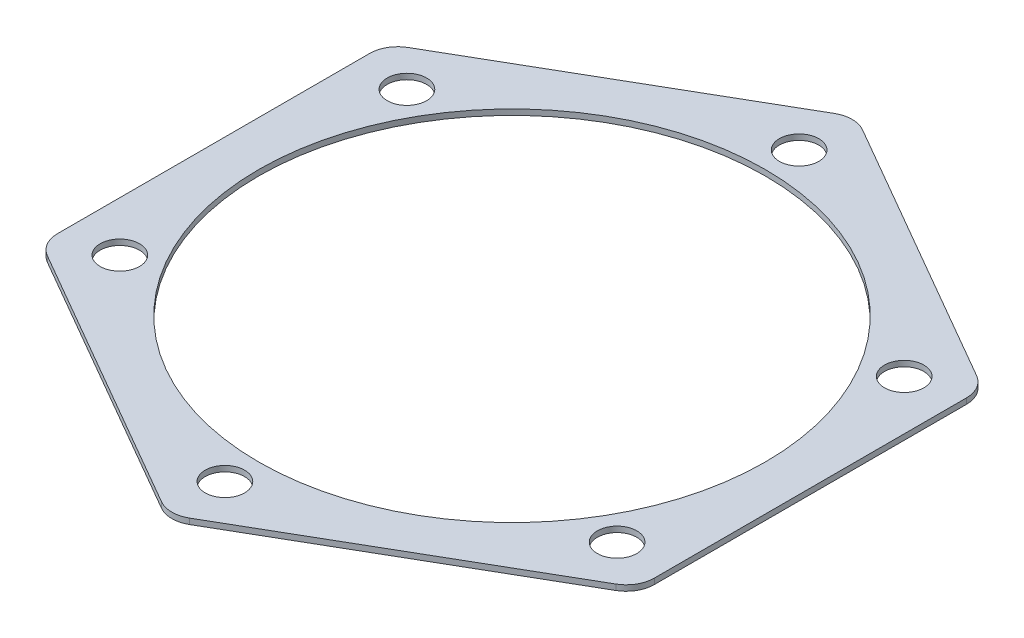
ISO-10303-21;
HEADER;
FILE_DESCRIPTION(('STEP AP214'),'2;1');
FILE_NAME('part.step','',(''),(''),'','','');
FILE_SCHEMA(('AUTOMOTIVE_DESIGN { 1 0 10303 214 1 1 1 1 }'));
ENDSEC;
DATA;
#1=APPLICATION_CONTEXT('core data for automotive mechanical design processes');
#2=APPLICATION_PROTOCOL_DEFINITION('international standard','automotive_design',2000,#1);
#3=PRODUCT_CONTEXT('',#1,'mechanical');
#4=PRODUCT('Part','Part','',(#3));
#5=PRODUCT_RELATED_PRODUCT_CATEGORY('part','',(#4));
#6=PRODUCT_DEFINITION_FORMATION('','',#4);
#7=PRODUCT_DEFINITION_CONTEXT('part definition',#1,'design');
#8=PRODUCT_DEFINITION('design','',#6,#7);
#9=PRODUCT_DEFINITION_SHAPE('','',#8);
#10=(LENGTH_UNIT() NAMED_UNIT(*) SI_UNIT(.MILLI.,.METRE.));
#11=(NAMED_UNIT(*) PLANE_ANGLE_UNIT() SI_UNIT($,.RADIAN.));
#12=(NAMED_UNIT(*) SI_UNIT($,.STERADIAN.) SOLID_ANGLE_UNIT());
#13=UNCERTAINTY_MEASURE_WITH_UNIT(LENGTH_MEASURE(1.E-05),#10,'distance_accuracy_value','');
#14=(GEOMETRIC_REPRESENTATION_CONTEXT(3) GLOBAL_UNCERTAINTY_ASSIGNED_CONTEXT((#13)) GLOBAL_UNIT_ASSIGNED_CONTEXT((#10,
#11,#12)) REPRESENTATION_CONTEXT('',''));
#15=CARTESIAN_POINT('',(0.,0.,0.));
#16=DIRECTION('',(0.,0.,1.));
#17=DIRECTION('',(1.,0.,0.));
#18=AXIS2_PLACEMENT_3D('',#15,#16,#17);
#19=CARTESIAN_POINT('',(48.0000000000002,1.,27.7128129211015));
#20=DIRECTION('',(0.,1.,0.));
#21=DIRECTION('',(0.,0.,1.));
#22=AXIS2_PLACEMENT_3D('',#19,#20,#21);
#23=PLANE('',#22);
#24=CARTESIAN_POINT('',(-44.167295593002,1.,25.5000000000025));
#25=DIRECTION('',(0.,1.,0.));
#26=DIRECTION('',(0.,0.,1.));
#27=AXIS2_PLACEMENT_3D('',#24,#25,#26);
#28=CIRCLE('',#27,3.50000000000536);
#29=CARTESIAN_POINT('',(-44.167295593002,1.,29.0000000000079));
#30=VERTEX_POINT('',#29);
#31=EDGE_CURVE('E305',#30,#30,#28,.T.);
#32=ORIENTED_EDGE('',*,*,#31,.F.);
#33=EDGE_LOOP('',(#32));
#34=FACE_BOUND('',#33,.T.);
#35=CARTESIAN_POINT('',(44.1672955930107,1.,25.4999999999975));
#36=DIRECTION('',(0.,1.,0.));
#37=DIRECTION('',(0.,0.,1.));
#38=AXIS2_PLACEMENT_3D('',#35,#36,#37);
#39=CIRCLE('',#38,3.50000000000365);
#40=CARTESIAN_POINT('',(44.1672955930107,1.,29.0000000000011));
#41=VERTEX_POINT('',#40);
#42=EDGE_CURVE('E317',#41,#41,#39,.T.);
#43=ORIENTED_EDGE('',*,*,#42,.F.);
#44=EDGE_LOOP('',(#43));
#45=FACE_BOUND('',#44,.T.);
#46=CARTESIAN_POINT('',(0.,1.,-51.));
#47=DIRECTION('',(0.,1.,0.));
#48=DIRECTION('',(0.,0.,1.));
#49=AXIS2_PLACEMENT_3D('',#46,#47,#48);
#50=CIRCLE('',#49,3.5);
#51=CARTESIAN_POINT('',(0.,1.,-47.5));
#52=VERTEX_POINT('',#51);
#53=EDGE_CURVE('E329',#52,#52,#50,.T.);
#54=ORIENTED_EDGE('',*,*,#53,.F.);
#55=EDGE_LOOP('',(#54));
#56=FACE_BOUND('',#55,.T.);
#57=CARTESIAN_POINT('',(48.0000000000002,1.,27.7128129211015));
#58=DIRECTION('',(0.,1.,0.));
#59=DIRECTION('',(0.,0.,1.));
#60=AXIS2_PLACEMENT_3D('',#57,#58,#59);
#61=CIRCLE('',#60,5.);
#62=CARTESIAN_POINT('',(50.5000000000002,1.,32.0429399400237));
#63=VERTEX_POINT('',#62);
#64=CARTESIAN_POINT('',(53.0000000000002,1.,27.7128129211015));
#65=VERTEX_POINT('',#64);
#66=EDGE_CURVE('E179',#63,#65,#61,.T.);
#67=ORIENTED_EDGE('',*,*,#66,.T.);
#68=DIRECTION('',(0.,0.,-1.));
#69=VECTOR('',#68,1.);
#70=CARTESIAN_POINT('',(53.0000000000002,1.,27.7128129211015));
#71=LINE('',#70,#69);
#72=CARTESIAN_POINT('',(52.9999999999996,1.,-27.7128129211026));
#73=VERTEX_POINT('',#72);
#74=EDGE_CURVE('E107',#65,#73,#71,.T.);
#75=ORIENTED_EDGE('',*,*,#74,.T.);
#76=CARTESIAN_POINT('',(47.9999999999996,1.,-27.7128129211026));
#77=DIRECTION('',(0.,1.,0.));
#78=DIRECTION('',(0.,0.,1.));
#79=AXIS2_PLACEMENT_3D('',#76,#77,#78);
#80=CIRCLE('',#79,5.);
#81=CARTESIAN_POINT('',(50.4999999999996,1.,-32.0429399400248));
#82=VERTEX_POINT('',#81);
#83=EDGE_CURVE('E206',#73,#82,#80,.T.);
#84=ORIENTED_EDGE('',*,*,#83,.T.);
#85=DIRECTION('',(-0.866025403784442,0.,-0.499999999999995));
#86=VECTOR('',#85,1.);
#87=CARTESIAN_POINT('',(50.4999999999996,1.,-32.0429399400248));
#88=LINE('',#87,#86);
#89=CARTESIAN_POINT('',(2.50000000000002,1.,-59.7557528611262));
#90=VERTEX_POINT('',#89);
#91=EDGE_CURVE('E225',#82,#90,#88,.T.);
#92=ORIENTED_EDGE('',*,*,#91,.T.);
#93=CARTESIAN_POINT('',(0.,1.,-55.425625842204));
#94=DIRECTION('',(0.,1.,0.));
#95=DIRECTION('',(0.,0.,-1.));
#96=AXIS2_PLACEMENT_3D('',#93,#94,#95);
#97=CIRCLE('',#96,5.);
#98=CARTESIAN_POINT('',(-2.5,1.,-59.7557528611262));
#99=VERTEX_POINT('',#98);
#100=EDGE_CURVE('E222',#90,#99,#97,.T.);
#101=ORIENTED_EDGE('',*,*,#100,.T.);
#102=DIRECTION('',(-0.866025403784438,0.,0.500000000000001));
#103=VECTOR('',#102,1.);
#104=CARTESIAN_POINT('',(-2.5,1.,-59.7557528611262));
#105=LINE('',#104,#103);
#106=CARTESIAN_POINT('',(-50.5,1.,-32.0429399400241));
#107=VERTEX_POINT('',#106);
#108=EDGE_CURVE('E224',#99,#107,#105,.T.);
#109=ORIENTED_EDGE('',*,*,#108,.T.);
#110=CARTESIAN_POINT('',(-48.,1.,-27.7128129211019));
#111=DIRECTION('',(0.,1.,0.));
#112=DIRECTION('',(0.,0.,1.));
#113=AXIS2_PLACEMENT_3D('',#110,#111,#112);
#114=CIRCLE('',#113,5.);
#115=CARTESIAN_POINT('',(-53.,1.,-27.7128129211018));
#116=VERTEX_POINT('',#115);
#117=EDGE_CURVE('E227',#107,#116,#114,.T.);
#118=ORIENTED_EDGE('',*,*,#117,.T.);
#119=DIRECTION('',(0.,0.,1.));
#120=VECTOR('',#119,1.);
#121=CARTESIAN_POINT('',(-53.,1.,-27.7128129211018));
#122=LINE('',#121,#120);
#123=CARTESIAN_POINT('',(-52.9999999999998,1.,27.7128129211022));
#124=VERTEX_POINT('',#123);
#125=EDGE_CURVE('E233',#116,#124,#122,.T.);
#126=ORIENTED_EDGE('',*,*,#125,.T.);
#127=CARTESIAN_POINT('',(-47.9999999999998,1.,27.7128129211022));
#128=DIRECTION('',(0.,1.,0.));
#129=DIRECTION('',(0.,0.,1.));
#130=AXIS2_PLACEMENT_3D('',#127,#128,#129);
#131=CIRCLE('',#130,5.);
#132=CARTESIAN_POINT('',(-50.4999999999998,1.,32.0429399400244));
#133=VERTEX_POINT('',#132);
#134=EDGE_CURVE('E138',#124,#133,#131,.T.);
#135=ORIENTED_EDGE('',*,*,#134,.T.);
#136=DIRECTION('',(0.866025403784441,0.,0.499999999999995));
#137=VECTOR('',#136,1.);
#138=CARTESIAN_POINT('',(-50.4999999999998,1.,32.0429399400244));
#139=LINE('',#138,#137);
#140=CARTESIAN_POINT('',(-2.49999999999961,1.,59.7557528611262));
#141=VERTEX_POINT('',#140);
#142=EDGE_CURVE('E132',#133,#141,#139,.T.);
#143=ORIENTED_EDGE('',*,*,#142,.T.);
#144=CARTESIAN_POINT('',(3.86969014046492E-13,1.,55.425625842204));
#145=DIRECTION('',(0.,1.,0.));
#146=DIRECTION('',(0.,0.,1.));
#147=AXIS2_PLACEMENT_3D('',#144,#145,#146);
#148=CIRCLE('',#147,5.);
#149=CARTESIAN_POINT('',(2.50000000000044,1.,59.7557528611261));
#150=VERTEX_POINT('',#149);
#151=EDGE_CURVE('E136',#141,#150,#148,.T.);
#152=ORIENTED_EDGE('',*,*,#151,.T.);
#153=DIRECTION('',(0.866025403784435,0.,-0.500000000000007));
#154=VECTOR('',#153,1.);
#155=CARTESIAN_POINT('',(2.50000000000044,1.,59.7557528611261));
#156=LINE('',#155,#154);
#157=EDGE_CURVE('E52',#150,#63,#156,.T.);
#158=ORIENTED_EDGE('',*,*,#157,.T.);
#159=EDGE_LOOP('',(#67,#75,#84,#92,#101,#109,#118,#126,#135,#143,#152,#158));
#160=FACE_BOUND('',#159,.T.);
#161=CARTESIAN_POINT('',(0.,1.,0.));
#162=DIRECTION('',(0.,1.,0.));
#163=DIRECTION('',(0.,0.,1.));
#164=AXIS2_PLACEMENT_3D('',#161,#162,#163);
#165=CIRCLE('',#164,45.);
#166=CARTESIAN_POINT('',(0.,1.,45.));
#167=VERTEX_POINT('',#166);
#168=EDGE_CURVE('E160',#167,#167,#165,.T.);
#169=ORIENTED_EDGE('',*,*,#168,.F.);
#170=EDGE_LOOP('',(#169));
#171=FACE_BOUND('',#170,.T.);
#172=CARTESIAN_POINT('',(44.1672955930078,1.,-25.5000000000025));
#173=DIRECTION('',(0.,1.,0.));
#174=DIRECTION('',(0.,0.,1.));
#175=AXIS2_PLACEMENT_3D('',#172,#173,#174);
#176=CIRCLE('',#175,3.50000000000079);
#177=CARTESIAN_POINT('',(44.1672955930078,1.,-22.0000000000017));
#178=VERTEX_POINT('',#177);
#179=EDGE_CURVE('E323',#178,#178,#176,.T.);
#180=ORIENTED_EDGE('',*,*,#179,.F.);
#181=EDGE_LOOP('',(#180));
#182=FACE_BOUND('',#181,.T.);
#183=CARTESIAN_POINT('',(5.77929162777546E-12,1.,51.));
#184=DIRECTION('',(0.,1.,0.));
#185=DIRECTION('',(0.,0.,1.));
#186=AXIS2_PLACEMENT_3D('',#183,#184,#185);
#187=CIRCLE('',#186,3.50000000000587);
#188=CARTESIAN_POINT('',(5.77929162777546E-12,1.,54.5000000000059));
#189=VERTEX_POINT('',#188);
#190=EDGE_CURVE('E311',#189,#189,#187,.T.);
#191=ORIENTED_EDGE('',*,*,#190,.F.);
#192=EDGE_LOOP('',(#191));
#193=FACE_BOUND('',#192,.T.);
#194=CARTESIAN_POINT('',(-44.1672955930049,1.,-25.4999999999975));
#195=DIRECTION('',(0.,1.,0.));
#196=DIRECTION('',(0.,0.,1.));
#197=AXIS2_PLACEMENT_3D('',#194,#195,#196);
#198=CIRCLE('',#197,3.50000000000272);
#199=CARTESIAN_POINT('',(-44.1672955930049,1.,-21.9999999999947));
#200=VERTEX_POINT('',#199);
#201=EDGE_CURVE('E296',#200,#200,#198,.T.);
#202=ORIENTED_EDGE('',*,*,#201,.F.);
#203=EDGE_LOOP('',(#202));
#204=FACE_BOUND('',#203,.T.);
#205=ADVANCED_FACE('F35',(#34,#45,#56,#160,#171,#182,#193,#204),#23,.T.);
#206=CARTESIAN_POINT('',(48.0000000000002,0.,27.7128129211015));
#207=DIRECTION('',(0.,1.,0.));
#208=DIRECTION('',(0.,0.,1.));
#209=AXIS2_PLACEMENT_3D('',#206,#207,#208);
#210=PLANE('',#209);
#211=CARTESIAN_POINT('',(48.0000000000002,0.,27.7128129211015));
#212=DIRECTION('',(0.,1.,0.));
#213=DIRECTION('',(0.,0.,1.));
#214=AXIS2_PLACEMENT_3D('',#211,#212,#213);
#215=CIRCLE('',#214,5.);
#216=CARTESIAN_POINT('',(50.5000000000002,0.,32.0429399400237));
#217=VERTEX_POINT('',#216);
#218=CARTESIAN_POINT('',(53.0000000000002,0.,27.7128129211015));
#219=VERTEX_POINT('',#218);
#220=EDGE_CURVE('E156',#217,#219,#215,.T.);
#221=ORIENTED_EDGE('',*,*,#220,.F.);
#222=DIRECTION('',(0.866025403784435,0.,-0.500000000000007));
#223=VECTOR('',#222,1.);
#224=CARTESIAN_POINT('',(2.50000000000044,0.,59.7557528611261));
#225=LINE('',#224,#223);
#226=CARTESIAN_POINT('',(2.50000000000044,0.,59.7557528611261));
#227=VERTEX_POINT('',#226);
#228=EDGE_CURVE('E99',#227,#217,#225,.T.);
#229=ORIENTED_EDGE('',*,*,#228,.F.);
#230=CARTESIAN_POINT('',(3.86969014046492E-13,0.,55.425625842204));
#231=DIRECTION('',(0.,1.,0.));
#232=DIRECTION('',(0.,0.,1.));
#233=AXIS2_PLACEMENT_3D('',#230,#231,#232);
#234=CIRCLE('',#233,5.);
#235=CARTESIAN_POINT('',(-2.49999999999961,0.,59.7557528611262));
#236=VERTEX_POINT('',#235);
#237=EDGE_CURVE('E93',#236,#227,#234,.T.);
#238=ORIENTED_EDGE('',*,*,#237,.F.);
#239=DIRECTION('',(0.866025403784441,0.,0.499999999999995));
#240=VECTOR('',#239,1.);
#241=CARTESIAN_POINT('',(-50.4999999999998,0.,32.0429399400244));
#242=LINE('',#241,#240);
#243=CARTESIAN_POINT('',(-50.4999999999998,0.,32.0429399400244));
#244=VERTEX_POINT('',#243);
#245=EDGE_CURVE('E146',#244,#236,#242,.T.);
#246=ORIENTED_EDGE('',*,*,#245,.F.);
#247=CARTESIAN_POINT('',(-47.9999999999998,0.,27.7128129211022));
#248=DIRECTION('',(0.,1.,0.));
#249=DIRECTION('',(0.,0.,1.));
#250=AXIS2_PLACEMENT_3D('',#247,#248,#249);
#251=CIRCLE('',#250,5.);
#252=CARTESIAN_POINT('',(-52.9999999999998,0.,27.7128129211022));
#253=VERTEX_POINT('',#252);
#254=EDGE_CURVE('E174',#253,#244,#251,.T.);
#255=ORIENTED_EDGE('',*,*,#254,.F.);
#256=DIRECTION('',(0.,0.,1.));
#257=VECTOR('',#256,1.);
#258=CARTESIAN_POINT('',(-53.,0.,-27.7128129211018));
#259=LINE('',#258,#257);
#260=CARTESIAN_POINT('',(-53.,0.,-27.7128129211018));
#261=VERTEX_POINT('',#260);
#262=EDGE_CURVE('E172',#261,#253,#259,.T.);
#263=ORIENTED_EDGE('',*,*,#262,.F.);
#264=CARTESIAN_POINT('',(-48.,0.,-27.7128129211019));
#265=DIRECTION('',(0.,1.,0.));
#266=DIRECTION('',(0.,0.,1.));
#267=AXIS2_PLACEMENT_3D('',#264,#265,#266);
#268=CIRCLE('',#267,5.);
#269=CARTESIAN_POINT('',(-50.5,0.,-32.0429399400241));
#270=VERTEX_POINT('',#269);
#271=EDGE_CURVE('E170',#270,#261,#268,.T.);
#272=ORIENTED_EDGE('',*,*,#271,.F.);
#273=DIRECTION('',(-0.866025403784438,0.,0.500000000000001));
#274=VECTOR('',#273,1.);
#275=CARTESIAN_POINT('',(-2.5,0.,-59.7557528611262));
#276=LINE('',#275,#274);
#277=CARTESIAN_POINT('',(-2.5,0.,-59.7557528611262));
#278=VERTEX_POINT('',#277);
#279=EDGE_CURVE('E168',#278,#270,#276,.T.);
#280=ORIENTED_EDGE('',*,*,#279,.F.);
#281=CARTESIAN_POINT('',(0.,0.,-55.425625842204));
#282=DIRECTION('',(0.,1.,0.));
#283=DIRECTION('',(0.,0.,-1.));
#284=AXIS2_PLACEMENT_3D('',#281,#282,#283);
#285=CIRCLE('',#284,5.);
#286=CARTESIAN_POINT('',(2.50000000000002,0.,-59.7557528611262));
#287=VERTEX_POINT('',#286);
#288=EDGE_CURVE('E166',#287,#278,#285,.T.);
#289=ORIENTED_EDGE('',*,*,#288,.F.);
#290=DIRECTION('',(-0.866025403784442,0.,-0.499999999999995));
#291=VECTOR('',#290,1.);
#292=CARTESIAN_POINT('',(50.4999999999996,0.,-32.0429399400248));
#293=LINE('',#292,#291);
#294=CARTESIAN_POINT('',(50.4999999999996,0.,-32.0429399400248));
#295=VERTEX_POINT('',#294);
#296=EDGE_CURVE('E164',#295,#287,#293,.T.);
#297=ORIENTED_EDGE('',*,*,#296,.F.);
#298=CARTESIAN_POINT('',(47.9999999999996,0.,-27.7128129211026));
#299=DIRECTION('',(0.,1.,0.));
#300=DIRECTION('',(0.,0.,1.));
#301=AXIS2_PLACEMENT_3D('',#298,#299,#300);
#302=CIRCLE('',#301,5.);
#303=CARTESIAN_POINT('',(52.9999999999996,0.,-27.7128129211026));
#304=VERTEX_POINT('',#303);
#305=EDGE_CURVE('E162',#304,#295,#302,.T.);
#306=ORIENTED_EDGE('',*,*,#305,.F.);
#307=DIRECTION('',(0.,0.,-1.));
#308=VECTOR('',#307,1.);
#309=CARTESIAN_POINT('',(53.0000000000002,0.,27.7128129211015));
#310=LINE('',#309,#308);
#311=EDGE_CURVE('E159',#219,#304,#310,.T.);
#312=ORIENTED_EDGE('',*,*,#311,.F.);
#313=EDGE_LOOP('',(#221,#229,#238,#246,#255,#263,#272,#280,#289,#297,#306,#312));
#314=FACE_BOUND('',#313,.T.);
#315=CARTESIAN_POINT('',(0.,0.,0.));
#316=DIRECTION('',(0.,1.,0.));
#317=DIRECTION('',(0.,0.,1.));
#318=AXIS2_PLACEMENT_3D('',#315,#316,#317);
#319=CIRCLE('',#318,45.);
#320=CARTESIAN_POINT('',(0.,0.,45.));
#321=VERTEX_POINT('',#320);
#322=EDGE_CURVE('E332',#321,#321,#319,.T.);
#323=ORIENTED_EDGE('',*,*,#322,.T.);
#324=EDGE_LOOP('',(#323));
#325=FACE_BOUND('',#324,.T.);
#326=CARTESIAN_POINT('',(0.,0.,-51.));
#327=DIRECTION('',(0.,1.,0.));
#328=DIRECTION('',(0.,0.,1.));
#329=AXIS2_PLACEMENT_3D('',#326,#327,#328);
#330=CIRCLE('',#329,3.5);
#331=CARTESIAN_POINT('',(0.,0.,-47.5));
#332=VERTEX_POINT('',#331);
#333=EDGE_CURVE('E326',#332,#332,#330,.T.);
#334=ORIENTED_EDGE('',*,*,#333,.T.);
#335=EDGE_LOOP('',(#334));
#336=FACE_BOUND('',#335,.T.);
#337=CARTESIAN_POINT('',(44.1672955930078,0.,-25.5000000000025));
#338=DIRECTION('',(0.,1.,0.));
#339=DIRECTION('',(0.,0.,1.));
#340=AXIS2_PLACEMENT_3D('',#337,#338,#339);
#341=CIRCLE('',#340,3.50000000000079);
#342=CARTESIAN_POINT('',(44.1672955930078,0.,-22.0000000000017));
#343=VERTEX_POINT('',#342);
#344=EDGE_CURVE('E320',#343,#343,#341,.T.);
#345=ORIENTED_EDGE('',*,*,#344,.T.);
#346=EDGE_LOOP('',(#345));
#347=FACE_BOUND('',#346,.T.);
#348=CARTESIAN_POINT('',(44.1672955930107,0.,25.4999999999975));
#349=DIRECTION('',(0.,1.,0.));
#350=DIRECTION('',(0.,0.,1.));
#351=AXIS2_PLACEMENT_3D('',#348,#349,#350);
#352=CIRCLE('',#351,3.50000000000365);
#353=CARTESIAN_POINT('',(44.1672955930107,0.,29.0000000000011));
#354=VERTEX_POINT('',#353);
#355=EDGE_CURVE('E314',#354,#354,#352,.T.);
#356=ORIENTED_EDGE('',*,*,#355,.T.);
#357=EDGE_LOOP('',(#356));
#358=FACE_BOUND('',#357,.T.);
#359=CARTESIAN_POINT('',(5.77929162777546E-12,0.,51.));
#360=DIRECTION('',(0.,1.,0.));
#361=DIRECTION('',(0.,0.,1.));
#362=AXIS2_PLACEMENT_3D('',#359,#360,#361);
#363=CIRCLE('',#362,3.50000000000587);
#364=CARTESIAN_POINT('',(5.77929162777546E-12,0.,54.5000000000059));
#365=VERTEX_POINT('',#364);
#366=EDGE_CURVE('E308',#365,#365,#363,.T.);
#367=ORIENTED_EDGE('',*,*,#366,.T.);
#368=EDGE_LOOP('',(#367));
#369=FACE_BOUND('',#368,.T.);
#370=CARTESIAN_POINT('',(-44.167295593002,0.,25.5000000000025));
#371=DIRECTION('',(0.,1.,0.));
#372=DIRECTION('',(0.,0.,1.));
#373=AXIS2_PLACEMENT_3D('',#370,#371,#372);
#374=CIRCLE('',#373,3.50000000000536);
#375=CARTESIAN_POINT('',(-44.167295593002,0.,29.0000000000079));
#376=VERTEX_POINT('',#375);
#377=EDGE_CURVE('E302',#376,#376,#374,.T.);
#378=ORIENTED_EDGE('',*,*,#377,.T.);
#379=EDGE_LOOP('',(#378));
#380=FACE_BOUND('',#379,.T.);
#381=CARTESIAN_POINT('',(-44.1672955930049,0.,-25.4999999999975));
#382=DIRECTION('',(0.,1.,0.));
#383=DIRECTION('',(0.,0.,1.));
#384=AXIS2_PLACEMENT_3D('',#381,#382,#383);
#385=CIRCLE('',#384,3.50000000000272);
#386=CARTESIAN_POINT('',(-44.1672955930049,0.,-21.9999999999947));
#387=VERTEX_POINT('',#386);
#388=EDGE_CURVE('E299',#387,#387,#385,.T.);
#389=ORIENTED_EDGE('',*,*,#388,.T.);
#390=EDGE_LOOP('',(#389));
#391=FACE_BOUND('',#390,.T.);
#392=ADVANCED_FACE('F210',(#314,#325,#336,#347,#358,#369,#380,#391),#210,.F.);
#393=CARTESIAN_POINT('',(48.0000000000002,1.,27.7128129211015));
#394=DIRECTION('',(0.,-1.,0.));
#395=DIRECTION('',(0.,0.,-1.));
#396=AXIS2_PLACEMENT_3D('',#393,#394,#395);
#397=CYLINDRICAL_SURFACE('',#396,5.);
#398=ORIENTED_EDGE('',*,*,#220,.T.);
#399=DIRECTION('',(0.,-1.,0.));
#400=VECTOR('',#399,1.);
#401=CARTESIAN_POINT('',(53.0000000000002,1.,27.7128129211015));
#402=LINE('',#401,#400);
#403=EDGE_CURVE('E11',#65,#219,#402,.T.);
#404=ORIENTED_EDGE('',*,*,#403,.F.);
#405=ORIENTED_EDGE('',*,*,#66,.F.);
#406=DIRECTION('',(0.,-1.,0.));
#407=VECTOR('',#406,1.);
#408=CARTESIAN_POINT('',(50.5000000000002,1.,32.0429399400237));
#409=LINE('',#408,#407);
#410=EDGE_CURVE('E152',#63,#217,#409,.T.);
#411=ORIENTED_EDGE('',*,*,#410,.T.);
#412=EDGE_LOOP('',(#398,#404,#405,#411));
#413=FACE_BOUND('',#412,.T.);
#414=ADVANCED_FACE('F37',(#413),#397,.T.);
#415=CARTESIAN_POINT('',(53.0000000000002,1.,27.7128129211015));
#416=DIRECTION('',(-1.,0.,0.));
#417=DIRECTION('',(0.,0.,1.));
#418=AXIS2_PLACEMENT_3D('',#415,#416,#417);
#419=PLANE('',#418);
#420=ORIENTED_EDGE('',*,*,#311,.T.);
#421=DIRECTION('',(0.,-1.,0.));
#422=VECTOR('',#421,1.);
#423=CARTESIAN_POINT('',(52.9999999999996,1.,-27.7128129211026));
#424=LINE('',#423,#422);
#425=EDGE_CURVE('E44',#73,#304,#424,.T.);
#426=ORIENTED_EDGE('',*,*,#425,.F.);
#427=ORIENTED_EDGE('',*,*,#74,.F.);
#428=ORIENTED_EDGE('',*,*,#403,.T.);
#429=EDGE_LOOP('',(#420,#426,#427,#428));
#430=FACE_BOUND('',#429,.T.);
#431=ADVANCED_FACE('F469',(#430),#419,.F.);
#432=CARTESIAN_POINT('',(47.9999999999996,1.,-27.7128129211026));
#433=DIRECTION('',(0.,-1.,0.));
#434=DIRECTION('',(0.,0.,-1.));
#435=AXIS2_PLACEMENT_3D('',#432,#433,#434);
#436=CYLINDRICAL_SURFACE('',#435,5.);
#437=ORIENTED_EDGE('',*,*,#305,.T.);
#438=DIRECTION('',(0.,-1.,0.));
#439=VECTOR('',#438,1.);
#440=CARTESIAN_POINT('',(50.4999999999996,1.,-32.0429399400248));
#441=LINE('',#440,#439);
#442=EDGE_CURVE('E198',#82,#295,#441,.T.);
#443=ORIENTED_EDGE('',*,*,#442,.F.);
#444=ORIENTED_EDGE('',*,*,#83,.F.);
#445=ORIENTED_EDGE('',*,*,#425,.T.);
#446=EDGE_LOOP('',(#437,#443,#444,#445));
#447=FACE_BOUND('',#446,.T.);
#448=ADVANCED_FACE('F204',(#447),#436,.T.);
#449=CARTESIAN_POINT('',(50.4999999999996,1.,-32.0429399400248));
#450=DIRECTION('',(-0.499999999999995,0.,0.866025403784442));
#451=DIRECTION('',(0.866025403784442,0.,0.499999999999995));
#452=AXIS2_PLACEMENT_3D('',#449,#450,#451);
#453=PLANE('',#452);
#454=ORIENTED_EDGE('',*,*,#296,.T.);
#455=DIRECTION('',(0.,-1.,0.));
#456=VECTOR('',#455,1.);
#457=CARTESIAN_POINT('',(2.50000000000002,1.,-59.7557528611262));
#458=LINE('',#457,#456);
#459=EDGE_CURVE('E195',#90,#287,#458,.T.);
#460=ORIENTED_EDGE('',*,*,#459,.F.);
#461=ORIENTED_EDGE('',*,*,#91,.F.);
#462=ORIENTED_EDGE('',*,*,#442,.T.);
#463=EDGE_LOOP('',(#454,#460,#461,#462));
#464=FACE_BOUND('',#463,.T.);
#465=ADVANCED_FACE('F216',(#464),#453,.F.);
#466=CARTESIAN_POINT('',(0.,1.,-55.425625842204));
#467=DIRECTION('',(0.,-1.,0.));
#468=DIRECTION('',(0.,0.,-1.));
#469=AXIS2_PLACEMENT_3D('',#466,#467,#468);
#470=CYLINDRICAL_SURFACE('',#469,5.);
#471=ORIENTED_EDGE('',*,*,#288,.T.);
#472=DIRECTION('',(0.,-1.,0.));
#473=VECTOR('',#472,1.);
#474=CARTESIAN_POINT('',(-2.5,1.,-59.7557528611262));
#475=LINE('',#474,#473);
#476=EDGE_CURVE('E192',#99,#278,#475,.T.);
#477=ORIENTED_EDGE('',*,*,#476,.F.);
#478=ORIENTED_EDGE('',*,*,#100,.F.);
#479=ORIENTED_EDGE('',*,*,#459,.T.);
#480=EDGE_LOOP('',(#471,#477,#478,#479));
#481=FACE_BOUND('',#480,.T.);
#482=ADVANCED_FACE('F220',(#481),#470,.T.);
#483=CARTESIAN_POINT('',(-2.5,1.,-59.7557528611262));
#484=DIRECTION('',(0.500000000000001,0.,0.866025403784438));
#485=DIRECTION('',(0.866025403784438,0.,-0.500000000000001));
#486=AXIS2_PLACEMENT_3D('',#483,#484,#485);
#487=PLANE('',#486);
#488=ORIENTED_EDGE('',*,*,#279,.T.);
#489=DIRECTION('',(0.,-1.,0.));
#490=VECTOR('',#489,1.);
#491=CARTESIAN_POINT('',(-50.5,1.,-32.0429399400241));
#492=LINE('',#491,#490);
#493=EDGE_CURVE('E189',#107,#270,#492,.T.);
#494=ORIENTED_EDGE('',*,*,#493,.F.);
#495=ORIENTED_EDGE('',*,*,#108,.F.);
#496=ORIENTED_EDGE('',*,*,#476,.T.);
#497=EDGE_LOOP('',(#488,#494,#495,#496));
#498=FACE_BOUND('',#497,.T.);
#499=ADVANCED_FACE('F434',(#498),#487,.F.);
#500=CARTESIAN_POINT('',(-48.,1.,-27.7128129211019));
#501=DIRECTION('',(0.,-1.,0.));
#502=DIRECTION('',(0.,0.,-1.));
#503=AXIS2_PLACEMENT_3D('',#500,#501,#502);
#504=CYLINDRICAL_SURFACE('',#503,5.);
#505=ORIENTED_EDGE('',*,*,#271,.T.);
#506=DIRECTION('',(0.,-1.,0.));
#507=VECTOR('',#506,1.);
#508=CARTESIAN_POINT('',(-53.,1.,-27.7128129211018));
#509=LINE('',#508,#507);
#510=EDGE_CURVE('E186',#116,#261,#509,.T.);
#511=ORIENTED_EDGE('',*,*,#510,.F.);
#512=ORIENTED_EDGE('',*,*,#117,.F.);
#513=ORIENTED_EDGE('',*,*,#493,.T.);
#514=EDGE_LOOP('',(#505,#511,#512,#513));
#515=FACE_BOUND('',#514,.T.);
#516=ADVANCED_FACE('F425',(#515),#504,.T.);
#517=CARTESIAN_POINT('',(-53.,1.,-27.7128129211018));
#518=DIRECTION('',(1.,0.,0.));
#519=DIRECTION('',(0.,0.,-1.));
#520=AXIS2_PLACEMENT_3D('',#517,#518,#519);
#521=PLANE('',#520);
#522=ORIENTED_EDGE('',*,*,#262,.T.);
#523=DIRECTION('',(0.,-1.,0.));
#524=VECTOR('',#523,1.);
#525=CARTESIAN_POINT('',(-52.9999999999998,1.,27.7128129211022));
#526=LINE('',#525,#524);
#527=EDGE_CURVE('E183',#124,#253,#526,.T.);
#528=ORIENTED_EDGE('',*,*,#527,.F.);
#529=ORIENTED_EDGE('',*,*,#125,.F.);
#530=ORIENTED_EDGE('',*,*,#510,.T.);
#531=EDGE_LOOP('',(#522,#528,#529,#530));
#532=FACE_BOUND('',#531,.T.);
#533=ADVANCED_FACE('F239',(#532),#521,.F.);
#534=CARTESIAN_POINT('',(-47.9999999999998,1.,27.7128129211022));
#535=DIRECTION('',(0.,-1.,0.));
#536=DIRECTION('',(0.,0.,-1.));
#537=AXIS2_PLACEMENT_3D('',#534,#535,#536);
#538=CYLINDRICAL_SURFACE('',#537,5.);
#539=ORIENTED_EDGE('',*,*,#254,.T.);
#540=DIRECTION('',(0.,-1.,0.));
#541=VECTOR('',#540,1.);
#542=CARTESIAN_POINT('',(-50.4999999999998,1.,32.0429399400244));
#543=LINE('',#542,#541);
#544=EDGE_CURVE('E147',#133,#244,#543,.T.);
#545=ORIENTED_EDGE('',*,*,#544,.F.);
#546=ORIENTED_EDGE('',*,*,#134,.F.);
#547=ORIENTED_EDGE('',*,*,#527,.T.);
#548=EDGE_LOOP('',(#539,#545,#546,#547));
#549=FACE_BOUND('',#548,.T.);
#550=ADVANCED_FACE('F243',(#549),#538,.T.);
#551=CARTESIAN_POINT('',(-50.4999999999998,1.,32.0429399400244));
#552=DIRECTION('',(0.499999999999995,0.,-0.866025403784441));
#553=DIRECTION('',(-0.866025403784442,0.,-0.499999999999995));
#554=AXIS2_PLACEMENT_3D('',#551,#552,#553);
#555=PLANE('',#554);
#556=ORIENTED_EDGE('',*,*,#245,.T.);
#557=DIRECTION('',(0.,-1.,0.));
#558=VECTOR('',#557,1.);
#559=CARTESIAN_POINT('',(-2.49999999999961,1.,59.7557528611262));
#560=LINE('',#559,#558);
#561=EDGE_CURVE('E143',#141,#236,#560,.T.);
#562=ORIENTED_EDGE('',*,*,#561,.F.);
#563=ORIENTED_EDGE('',*,*,#142,.F.);
#564=ORIENTED_EDGE('',*,*,#544,.T.);
#565=EDGE_LOOP('',(#556,#562,#563,#564));
#566=FACE_BOUND('',#565,.T.);
#567=ADVANCED_FACE('F144',(#566),#555,.F.);
#568=CARTESIAN_POINT('',(3.86969014046492E-13,1.,55.425625842204));
#569=DIRECTION('',(0.,-1.,0.));
#570=DIRECTION('',(0.,0.,-1.));
#571=AXIS2_PLACEMENT_3D('',#568,#569,#570);
#572=CYLINDRICAL_SURFACE('',#571,5.);
#573=ORIENTED_EDGE('',*,*,#237,.T.);
#574=DIRECTION('',(0.,-1.,0.));
#575=VECTOR('',#574,1.);
#576=CARTESIAN_POINT('',(2.50000000000044,1.,59.7557528611261));
#577=LINE('',#576,#575);
#578=EDGE_CURVE('E148',#150,#227,#577,.T.);
#579=ORIENTED_EDGE('',*,*,#578,.F.);
#580=ORIENTED_EDGE('',*,*,#151,.F.);
#581=ORIENTED_EDGE('',*,*,#561,.T.);
#582=EDGE_LOOP('',(#573,#579,#580,#581));
#583=FACE_BOUND('',#582,.T.);
#584=ADVANCED_FACE('F150',(#583),#572,.T.);
#585=CARTESIAN_POINT('',(2.50000000000044,1.,59.7557528611261));
#586=DIRECTION('',(-0.500000000000007,0.,-0.866025403784435));
#587=DIRECTION('',(-0.866025403784435,0.,0.500000000000007));
#588=AXIS2_PLACEMENT_3D('',#585,#586,#587);
#589=PLANE('',#588);
#590=ORIENTED_EDGE('',*,*,#228,.T.);
#591=ORIENTED_EDGE('',*,*,#410,.F.);
#592=ORIENTED_EDGE('',*,*,#157,.F.);
#593=ORIENTED_EDGE('',*,*,#578,.T.);
#594=EDGE_LOOP('',(#590,#591,#592,#593));
#595=FACE_BOUND('',#594,.T.);
#596=ADVANCED_FACE('F247',(#595),#589,.F.);
#597=CARTESIAN_POINT('',(0.,1.,0.));
#598=DIRECTION('',(0.,-1.,0.));
#599=DIRECTION('',(0.,0.,-1.));
#600=AXIS2_PLACEMENT_3D('',#597,#598,#599);
#601=CYLINDRICAL_SURFACE('',#600,45.);
#602=ORIENTED_EDGE('',*,*,#168,.T.);
#603=EDGE_LOOP('',(#602));
#604=FACE_BOUND('',#603,.T.);
#605=ORIENTED_EDGE('',*,*,#322,.F.);
#606=EDGE_LOOP('',(#605));
#607=FACE_BOUND('',#606,.T.);
#608=ADVANCED_FACE('F249',(#604,#607),#601,.F.);
#609=CARTESIAN_POINT('',(0.,1.,-51.));
#610=DIRECTION('',(0.,-1.,0.));
#611=DIRECTION('',(0.,0.,-1.));
#612=AXIS2_PLACEMENT_3D('',#609,#610,#611);
#613=CYLINDRICAL_SURFACE('',#612,3.5);
#614=ORIENTED_EDGE('',*,*,#53,.T.);
#615=EDGE_LOOP('',(#614));
#616=FACE_BOUND('',#615,.T.);
#617=ORIENTED_EDGE('',*,*,#333,.F.);
#618=EDGE_LOOP('',(#617));
#619=FACE_BOUND('',#618,.T.);
#620=ADVANCED_FACE('F255',(#616,#619),#613,.F.);
#621=CARTESIAN_POINT('',(44.1672955930078,1.,-25.5000000000025));
#622=DIRECTION('',(0.,-1.,0.));
#623=DIRECTION('',(0.,0.,-1.));
#624=AXIS2_PLACEMENT_3D('',#621,#622,#623);
#625=CYLINDRICAL_SURFACE('',#624,3.50000000000079);
#626=ORIENTED_EDGE('',*,*,#179,.T.);
#627=EDGE_LOOP('',(#626));
#628=FACE_BOUND('',#627,.T.);
#629=ORIENTED_EDGE('',*,*,#344,.F.);
#630=EDGE_LOOP('',(#629));
#631=FACE_BOUND('',#630,.T.);
#632=ADVANCED_FACE('F271',(#628,#631),#625,.F.);
#633=CARTESIAN_POINT('',(44.1672955930107,1.,25.4999999999975));
#634=DIRECTION('',(0.,-1.,0.));
#635=DIRECTION('',(0.,0.,-1.));
#636=AXIS2_PLACEMENT_3D('',#633,#634,#635);
#637=CYLINDRICAL_SURFACE('',#636,3.50000000000365);
#638=ORIENTED_EDGE('',*,*,#42,.T.);
#639=EDGE_LOOP('',(#638));
#640=FACE_BOUND('',#639,.T.);
#641=ORIENTED_EDGE('',*,*,#355,.F.);
#642=EDGE_LOOP('',(#641));
#643=FACE_BOUND('',#642,.T.);
#644=ADVANCED_FACE('F275',(#640,#643),#637,.F.);
#645=CARTESIAN_POINT('',(5.77929162777546E-12,1.,51.));
#646=DIRECTION('',(0.,-1.,0.));
#647=DIRECTION('',(0.,0.,-1.));
#648=AXIS2_PLACEMENT_3D('',#645,#646,#647);
#649=CYLINDRICAL_SURFACE('',#648,3.50000000000587);
#650=ORIENTED_EDGE('',*,*,#190,.T.);
#651=EDGE_LOOP('',(#650));
#652=FACE_BOUND('',#651,.T.);
#653=ORIENTED_EDGE('',*,*,#366,.F.);
#654=EDGE_LOOP('',(#653));
#655=FACE_BOUND('',#654,.T.);
#656=ADVANCED_FACE('F279',(#652,#655),#649,.F.);
#657=CARTESIAN_POINT('',(-44.167295593002,1.,25.5000000000025));
#658=DIRECTION('',(0.,-1.,0.));
#659=DIRECTION('',(0.,0.,-1.));
#660=AXIS2_PLACEMENT_3D('',#657,#658,#659);
#661=CYLINDRICAL_SURFACE('',#660,3.50000000000536);
#662=ORIENTED_EDGE('',*,*,#31,.T.);
#663=EDGE_LOOP('',(#662));
#664=FACE_BOUND('',#663,.T.);
#665=ORIENTED_EDGE('',*,*,#377,.F.);
#666=EDGE_LOOP('',(#665));
#667=FACE_BOUND('',#666,.T.);
#668=ADVANCED_FACE('F283',(#664,#667),#661,.F.);
#669=CARTESIAN_POINT('',(-44.1672955930049,1.,-25.4999999999975));
#670=DIRECTION('',(0.,-1.,0.));
#671=DIRECTION('',(0.,0.,-1.));
#672=AXIS2_PLACEMENT_3D('',#669,#670,#671);
#673=CYLINDRICAL_SURFACE('',#672,3.50000000000272);
#674=ORIENTED_EDGE('',*,*,#201,.T.);
#675=EDGE_LOOP('',(#674));
#676=FACE_BOUND('',#675,.T.);
#677=ORIENTED_EDGE('',*,*,#388,.F.);
#678=EDGE_LOOP('',(#677));
#679=FACE_BOUND('',#678,.T.);
#680=ADVANCED_FACE('F287',(#676,#679),#673,.F.);
#681=CLOSED_SHELL('',(#205,#392,#414,#431,#448,#465,#482,#499,#516,#533,#550,#567,#584,#596,
#608,#620,#632,#644,#656,#668,#680));
#682=MANIFOLD_SOLID_BREP('B2',#681);
#683=ADVANCED_BREP_SHAPE_REPRESENTATION('',(#18,#682),#14);
#684=SHAPE_DEFINITION_REPRESENTATION(#9,#683);
ENDSEC;
END-ISO-10303-21;
